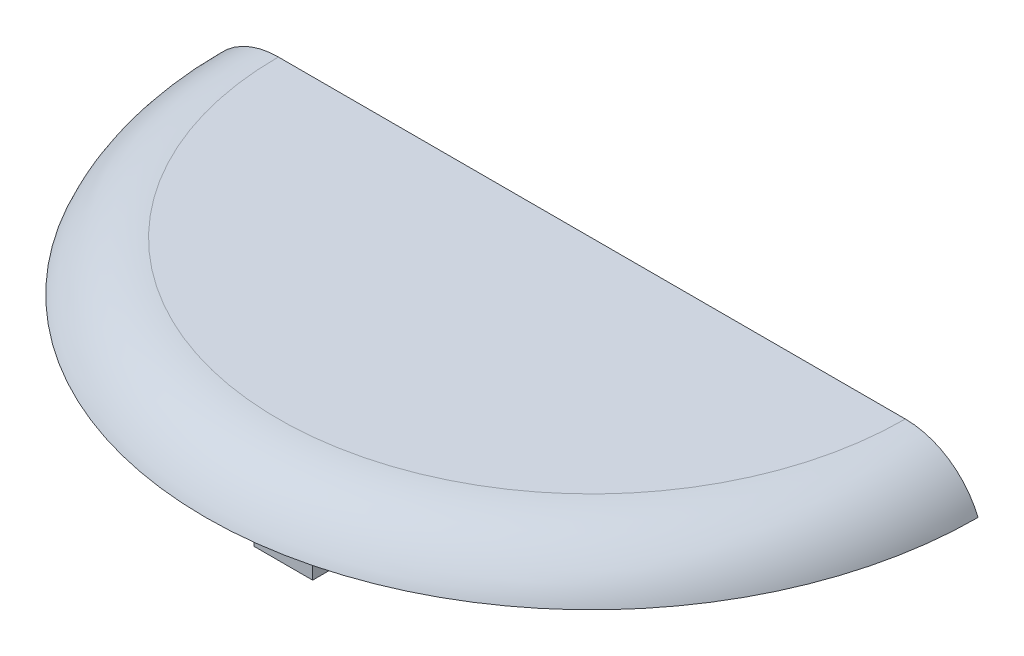
ISO-10303-21;
HEADER;
FILE_DESCRIPTION(('STEP AP214'),'2;1');
FILE_NAME('part.step','',(''),(''),'','','');
FILE_SCHEMA(('AUTOMOTIVE_DESIGN { 1 0 10303 214 1 1 1 1 }'));
ENDSEC;
DATA;
#1=APPLICATION_CONTEXT('core data for automotive mechanical design processes');
#2=APPLICATION_PROTOCOL_DEFINITION('international standard','automotive_design',2000,#1);
#3=PRODUCT_CONTEXT('',#1,'mechanical');
#4=PRODUCT('Part','Part','',(#3));
#5=PRODUCT_RELATED_PRODUCT_CATEGORY('part','',(#4));
#6=PRODUCT_DEFINITION_FORMATION('','',#4);
#7=PRODUCT_DEFINITION_CONTEXT('part definition',#1,'design');
#8=PRODUCT_DEFINITION('design','',#6,#7);
#9=PRODUCT_DEFINITION_SHAPE('','',#8);
#10=(LENGTH_UNIT() NAMED_UNIT(*) SI_UNIT(.MILLI.,.METRE.));
#11=(NAMED_UNIT(*) PLANE_ANGLE_UNIT() SI_UNIT($,.RADIAN.));
#12=(NAMED_UNIT(*) SI_UNIT($,.STERADIAN.) SOLID_ANGLE_UNIT());
#13=UNCERTAINTY_MEASURE_WITH_UNIT(LENGTH_MEASURE(1.E-05),#10,'distance_accuracy_value','');
#14=(GEOMETRIC_REPRESENTATION_CONTEXT(3) GLOBAL_UNCERTAINTY_ASSIGNED_CONTEXT((#13)) GLOBAL_UNIT_ASSIGNED_CONTEXT((#10,
#11,#12)) REPRESENTATION_CONTEXT('',''));
#15=CARTESIAN_POINT('',(0.,0.,0.));
#16=DIRECTION('',(0.,0.,1.));
#17=DIRECTION('',(1.,0.,0.));
#18=AXIS2_PLACEMENT_3D('',#15,#16,#17);
#19=CARTESIAN_POINT('',(0.,58.4278760968653,0.));
#20=DIRECTION('',(0.,1.,0.));
#21=DIRECTION('',(0.,0.,1.));
#22=AXIS2_PLACEMENT_3D('',#19,#20,#21);
#23=PLANE('',#22);
#24=DIRECTION('',(1.,0.,0.));
#25=VECTOR('',#24,1.);
#26=CARTESIAN_POINT('',(-3.,58.4278760968653,31.5));
#27=LINE('',#26,#25);
#28=CARTESIAN_POINT('',(-3.,58.4278760968653,31.5));
#29=VERTEX_POINT('',#28);
#30=CARTESIAN_POINT('',(3.,58.4278760968653,31.5));
#31=VERTEX_POINT('',#30);
#32=EDGE_CURVE('E123',#29,#31,#27,.T.);
#33=ORIENTED_EDGE('',*,*,#32,.T.);
#34=DIRECTION('',(0.,0.,-1.));
#35=VECTOR('',#34,1.);
#36=CARTESIAN_POINT('',(3.,58.4278760968653,28.5));
#37=LINE('',#36,#35);
#38=CARTESIAN_POINT('',(3.,58.4278760968653,28.5));
#39=VERTEX_POINT('',#38);
#40=EDGE_CURVE('E135',#31,#39,#37,.T.);
#41=ORIENTED_EDGE('',*,*,#40,.T.);
#42=DIRECTION('',(-1.,0.,0.));
#43=VECTOR('',#42,1.);
#44=CARTESIAN_POINT('',(-3.,58.4278760968653,28.5));
#45=LINE('',#44,#43);
#46=CARTESIAN_POINT('',(-3.,58.4278760968653,28.5));
#47=VERTEX_POINT('',#46);
#48=EDGE_CURVE('E100',#39,#47,#45,.T.);
#49=ORIENTED_EDGE('',*,*,#48,.T.);
#50=DIRECTION('',(0.,0.,1.));
#51=VECTOR('',#50,1.);
#52=CARTESIAN_POINT('',(-3.,58.4278760968653,28.5));
#53=LINE('',#52,#51);
#54=EDGE_CURVE('E57',#47,#29,#53,.T.);
#55=ORIENTED_EDGE('',*,*,#54,.T.);
#56=EDGE_LOOP('',(#33,#41,#49,#55));
#57=FACE_BOUND('',#56,.T.);
#58=CARTESIAN_POINT('',(0.,58.4278760968653,0.));
#59=DIRECTION('',(0.,1.,0.));
#60=DIRECTION('',(0.,0.,1.));
#61=AXIS2_PLACEMENT_3D('',#58,#59,#60);
#62=CIRCLE('',#61,39.4161984870957);
#63=CARTESIAN_POINT('',(39.4161984870957,58.4278760968653,0.));
#64=VERTEX_POINT('',#63);
#65=CARTESIAN_POINT('',(-39.4161984870957,58.4278760968653,2.77280175019557E-13));
#66=VERTEX_POINT('',#65);
#67=EDGE_CURVE('E12',#64,#66,#62,.F.);
#68=ORIENTED_EDGE('',*,*,#67,.T.);
#69=DIRECTION('',(-1.,0.,0.));
#70=VECTOR('',#69,1.);
#71=CARTESIAN_POINT('',(21.,58.4278760968653,0.));
#72=LINE('',#71,#70);
#73=EDGE_CURVE('E50',#64,#66,#72,.T.);
#74=ORIENTED_EDGE('',*,*,#73,.F.);
#75=EDGE_LOOP('',(#68,#74));
#76=FACE_BOUND('',#75,.T.);
#77=ADVANCED_FACE('F41',(#57,#76),#23,.F.);
#78=CARTESIAN_POINT('',(0.,60.9278760968653,15.));
#79=DIRECTION('',(0.,0.,-1.));
#80=DIRECTION('',(-1.,0.,0.));
#81=AXIS2_PLACEMENT_3D('',#78,#79,#80);
#82=PLANE('',#81);
#83=CARTESIAN_POINT('',(0.,60.9278760968653,15.));
#84=DIRECTION('',(0.,0.,-1.));
#85=DIRECTION('',(-1.,0.,0.));
#86=AXIS2_PLACEMENT_3D('',#83,#84,#85);
#87=CIRCLE('',#86,1.);
#88=CARTESIAN_POINT('',(-1.,60.9278760968653,15.));
#89=VERTEX_POINT('',#88);
#90=EDGE_CURVE('E167',#89,#89,#87,.T.);
#91=ORIENTED_EDGE('',*,*,#90,.T.);
#92=EDGE_LOOP('',(#91));
#93=FACE_BOUND('',#92,.T.);
#94=ADVANCED_FACE('F208',(#93),#82,.T.);
#95=CARTESIAN_POINT('',(-30.4161984870957,60.9278760968653,15.));
#96=DIRECTION('',(0.,0.,-1.));
#97=DIRECTION('',(-1.,0.,0.));
#98=AXIS2_PLACEMENT_3D('',#95,#96,#97);
#99=PLANE('',#98);
#100=CARTESIAN_POINT('',(-30.4161984870957,60.9278760968653,15.));
#101=DIRECTION('',(0.,0.,-1.));
#102=DIRECTION('',(-1.,0.,0.));
#103=AXIS2_PLACEMENT_3D('',#100,#101,#102);
#104=CIRCLE('',#103,0.999999999999998);
#105=CARTESIAN_POINT('',(-31.4161984870957,60.9278760968653,15.));
#106=VERTEX_POINT('',#105);
#107=EDGE_CURVE('E159',#106,#106,#104,.T.);
#108=ORIENTED_EDGE('',*,*,#107,.T.);
#109=EDGE_LOOP('',(#108));
#110=FACE_BOUND('',#109,.T.);
#111=ADVANCED_FACE('F204',(#110),#99,.T.);
#112=CARTESIAN_POINT('',(30.4161984870957,60.9278760968653,15.));
#113=DIRECTION('',(0.,0.,-1.));
#114=DIRECTION('',(-1.,0.,0.));
#115=AXIS2_PLACEMENT_3D('',#112,#113,#114);
#116=PLANE('',#115);
#117=CARTESIAN_POINT('',(30.4161984870957,60.9278760968653,15.));
#118=DIRECTION('',(0.,0.,-1.));
#119=DIRECTION('',(-1.,0.,0.));
#120=AXIS2_PLACEMENT_3D('',#117,#118,#119);
#121=CIRCLE('',#120,1.);
#122=CARTESIAN_POINT('',(29.4161984870957,60.9278760968653,15.));
#123=VERTEX_POINT('',#122);
#124=EDGE_CURVE('E150',#123,#123,#121,.T.);
#125=ORIENTED_EDGE('',*,*,#124,.T.);
#126=EDGE_LOOP('',(#125));
#127=FACE_BOUND('',#126,.T.);
#128=ADVANCED_FACE('F196',(#127),#116,.T.);
#129=CARTESIAN_POINT('',(0.,63.4278760968653,0.));
#130=DIRECTION('',(0.,1.,0.));
#131=DIRECTION('',(0.,0.,1.));
#132=AXIS2_PLACEMENT_3D('',#129,#130,#131);
#133=PLANE('',#132);
#134=DIRECTION('',(1.,0.,0.));
#135=VECTOR('',#134,1.);
#136=CARTESIAN_POINT('',(0.,63.4278760968653,0.));
#137=LINE('',#136,#135);
#138=CARTESIAN_POINT('',(-32.,63.4278760968653,2.51386656396706E-13));
#139=VERTEX_POINT('',#138);
#140=CARTESIAN_POINT('',(32.,63.4278760968653,0.));
#141=VERTEX_POINT('',#140);
#142=EDGE_CURVE('E183',#139,#141,#137,.T.);
#143=ORIENTED_EDGE('',*,*,#142,.F.);
#144=CARTESIAN_POINT('',(0.,63.4278760968653,0.));
#145=DIRECTION('',(0.,-1.,0.));
#146=DIRECTION('',(0.,0.,-1.));
#147=AXIS2_PLACEMENT_3D('',#144,#145,#146);
#148=CIRCLE('',#147,32.);
#149=EDGE_CURVE('E179',#141,#139,#148,.T.);
#150=ORIENTED_EDGE('',*,*,#149,.F.);
#151=EDGE_LOOP('',(#143,#150));
#152=FACE_BOUND('',#151,.T.);
#153=ADVANCED_FACE('F194',(#152),#133,.T.);
#154=CARTESIAN_POINT('',(0.,55.4278760968653,0.));
#155=DIRECTION('',(0.,-1.,0.));
#156=DIRECTION('',(0.,0.,-1.));
#157=AXIS2_PLACEMENT_3D('',#154,#155,#156);
#158=TOROIDAL_SURFACE('',#157,32.,8.);
#159=ORIENTED_EDGE('',*,*,#67,.F.);
#160=CARTESIAN_POINT('',(32.,55.4278760968653,-1.1172740284298E-13));
#161=DIRECTION('',(0.,0.,1.));
#162=DIRECTION('',(1.,0.,0.));
#163=AXIS2_PLACEMENT_3D('',#160,#161,#162);
#164=CIRCLE('',#163,8.);
#165=EDGE_CURVE('E154',#141,#64,#164,.F.);
#166=ORIENTED_EDGE('',*,*,#165,.F.);
#167=ORIENTED_EDGE('',*,*,#149,.T.);
#168=CARTESIAN_POINT('',(-32.,55.4278760968653,1.1172740284298E-13));
#169=DIRECTION('',(0.,0.,1.));
#170=DIRECTION('',(1.,0.,0.));
#171=AXIS2_PLACEMENT_3D('',#168,#169,#170);
#172=CIRCLE('',#171,8.);
#173=EDGE_CURVE('E176',#66,#139,#172,.F.);
#174=ORIENTED_EDGE('',*,*,#173,.F.);
#175=EDGE_LOOP('',(#159,#166,#167,#174));
#176=FACE_BOUND('',#175,.T.);
#177=ADVANCED_FACE('F193',(#176),#158,.T.);
#178=CARTESIAN_POINT('',(0.,60.9278760968653,15.));
#179=DIRECTION('',(0.,0.,-1.));
#180=DIRECTION('',(-1.,0.,0.));
#181=AXIS2_PLACEMENT_3D('',#178,#179,#180);
#182=CYLINDRICAL_SURFACE('',#181,1.);
#183=ORIENTED_EDGE('',*,*,#90,.F.);
#184=EDGE_LOOP('',(#183));
#185=FACE_BOUND('',#184,.T.);
#186=CARTESIAN_POINT('',(0.,60.9278760968653,0.));
#187=DIRECTION('',(0.,0.,-1.));
#188=DIRECTION('',(-1.,0.,0.));
#189=AXIS2_PLACEMENT_3D('',#186,#187,#188);
#190=CIRCLE('',#189,1.);
#191=CARTESIAN_POINT('',(-1.,60.9278760968653,0.));
#192=VERTEX_POINT('',#191);
#193=EDGE_CURVE('E144',#192,#192,#190,.T.);
#194=ORIENTED_EDGE('',*,*,#193,.T.);
#195=EDGE_LOOP('',(#194));
#196=FACE_BOUND('',#195,.T.);
#197=ADVANCED_FACE('F201',(#185,#196),#182,.F.);
#198=CARTESIAN_POINT('',(-30.4161984870957,60.9278760968653,15.));
#199=DIRECTION('',(0.,0.,-1.));
#200=DIRECTION('',(-1.,0.,0.));
#201=AXIS2_PLACEMENT_3D('',#198,#199,#200);
#202=CYLINDRICAL_SURFACE('',#201,0.999999999999998);
#203=ORIENTED_EDGE('',*,*,#107,.F.);
#204=EDGE_LOOP('',(#203));
#205=FACE_BOUND('',#204,.T.);
#206=CARTESIAN_POINT('',(-30.4161984870957,60.9278760968653,0.));
#207=DIRECTION('',(0.,0.,-1.));
#208=DIRECTION('',(-1.,0.,0.));
#209=AXIS2_PLACEMENT_3D('',#206,#207,#208);
#210=CIRCLE('',#209,0.999999999999998);
#211=CARTESIAN_POINT('',(-31.4161984870957,60.9278760968653,0.));
#212=VERTEX_POINT('',#211);
#213=EDGE_CURVE('E163',#212,#212,#210,.T.);
#214=ORIENTED_EDGE('',*,*,#213,.T.);
#215=EDGE_LOOP('',(#214));
#216=FACE_BOUND('',#215,.T.);
#217=ADVANCED_FACE('F229',(#205,#216),#202,.F.);
#218=CARTESIAN_POINT('',(30.4161984870957,60.9278760968653,15.));
#219=DIRECTION('',(0.,0.,-1.));
#220=DIRECTION('',(-1.,0.,0.));
#221=AXIS2_PLACEMENT_3D('',#218,#219,#220);
#222=CYLINDRICAL_SURFACE('',#221,1.);
#223=ORIENTED_EDGE('',*,*,#124,.F.);
#224=EDGE_LOOP('',(#223));
#225=FACE_BOUND('',#224,.T.);
#226=CARTESIAN_POINT('',(30.4161984870957,60.9278760968653,0.));
#227=DIRECTION('',(0.,0.,-1.));
#228=DIRECTION('',(-1.,0.,0.));
#229=AXIS2_PLACEMENT_3D('',#226,#227,#228);
#230=CIRCLE('',#229,1.);
#231=CARTESIAN_POINT('',(29.4161984870957,60.9278760968653,0.));
#232=VERTEX_POINT('',#231);
#233=EDGE_CURVE('E155',#232,#232,#230,.T.);
#234=ORIENTED_EDGE('',*,*,#233,.T.);
#235=EDGE_LOOP('',(#234));
#236=FACE_BOUND('',#235,.T.);
#237=ADVANCED_FACE('F219',(#225,#236),#222,.F.);
#238=CARTESIAN_POINT('',(21.,73.,0.));
#239=DIRECTION('',(0.,0.,1.));
#240=DIRECTION('',(1.,0.,0.));
#241=AXIS2_PLACEMENT_3D('',#238,#239,#240);
#242=PLANE('',#241);
#243=ORIENTED_EDGE('',*,*,#233,.F.);
#244=EDGE_LOOP('',(#243));
#245=FACE_BOUND('',#244,.T.);
#246=ORIENTED_EDGE('',*,*,#213,.F.);
#247=EDGE_LOOP('',(#246));
#248=FACE_BOUND('',#247,.T.);
#249=ORIENTED_EDGE('',*,*,#193,.F.);
#250=EDGE_LOOP('',(#249));
#251=FACE_BOUND('',#250,.T.);
#252=ORIENTED_EDGE('',*,*,#165,.T.);
#253=ORIENTED_EDGE('',*,*,#73,.T.);
#254=ORIENTED_EDGE('',*,*,#173,.T.);
#255=ORIENTED_EDGE('',*,*,#142,.T.);
#256=EDGE_LOOP('',(#252,#253,#254,#255));
#257=FACE_BOUND('',#256,.T.);
#258=ADVANCED_FACE('F188',(#245,#248,#251,#257),#242,.F.);
#259=CARTESIAN_POINT('',(3.,50.4278760968653,28.5));
#260=DIRECTION('',(1.,0.,0.));
#261=DIRECTION('',(0.,0.,-1.));
#262=AXIS2_PLACEMENT_3D('',#259,#260,#261);
#263=PLANE('',#262);
#264=CARTESIAN_POINT('',(3.,54.4278760968653,30.));
#265=DIRECTION('',(1.,0.,0.));
#266=DIRECTION('',(0.,0.,-1.));
#267=AXIS2_PLACEMENT_3D('',#264,#265,#266);
#268=CIRCLE('',#267,1.);
#269=CARTESIAN_POINT('',(3.,54.4278760968653,29.));
#270=VERTEX_POINT('',#269);
#271=EDGE_CURVE('E129',#270,#270,#268,.T.);
#272=ORIENTED_EDGE('',*,*,#271,.F.);
#273=EDGE_LOOP('',(#272));
#274=FACE_BOUND('',#273,.T.);
#275=ORIENTED_EDGE('',*,*,#40,.F.);
#276=DIRECTION('',(0.,1.,0.));
#277=VECTOR('',#276,1.);
#278=CARTESIAN_POINT('',(3.,50.4278760968653,31.5));
#279=LINE('',#278,#277);
#280=CARTESIAN_POINT('',(3.,50.4278760968653,31.5));
#281=VERTEX_POINT('',#280);
#282=EDGE_CURVE('E121',#281,#31,#279,.T.);
#283=ORIENTED_EDGE('',*,*,#282,.F.);
#284=DIRECTION('',(0.,0.,-1.));
#285=VECTOR('',#284,1.);
#286=CARTESIAN_POINT('',(3.,50.4278760968653,28.5));
#287=LINE('',#286,#285);
#288=CARTESIAN_POINT('',(3.,50.4278760968653,28.5));
#289=VERTEX_POINT('',#288);
#290=EDGE_CURVE('E114',#281,#289,#287,.T.);
#291=ORIENTED_EDGE('',*,*,#290,.T.);
#292=DIRECTION('',(0.,1.,0.));
#293=VECTOR('',#292,1.);
#294=CARTESIAN_POINT('',(3.,50.4278760968653,28.5));
#295=LINE('',#294,#293);
#296=EDGE_CURVE('E95',#289,#39,#295,.T.);
#297=ORIENTED_EDGE('',*,*,#296,.T.);
#298=EDGE_LOOP('',(#275,#283,#291,#297));
#299=FACE_BOUND('',#298,.T.);
#300=ADVANCED_FACE('F120',(#274,#299),#263,.T.);
#301=CARTESIAN_POINT('',(-3.,50.4278760968653,31.5));
#302=DIRECTION('',(0.,0.,1.));
#303=DIRECTION('',(1.,0.,0.));
#304=AXIS2_PLACEMENT_3D('',#301,#302,#303);
#305=PLANE('',#304);
#306=ORIENTED_EDGE('',*,*,#32,.F.);
#307=DIRECTION('',(0.,1.,0.));
#308=VECTOR('',#307,1.);
#309=CARTESIAN_POINT('',(-3.,50.4278760968653,31.5));
#310=LINE('',#309,#308);
#311=CARTESIAN_POINT('',(-3.,50.4278760968653,31.5));
#312=VERTEX_POINT('',#311);
#313=EDGE_CURVE('E145',#312,#29,#310,.T.);
#314=ORIENTED_EDGE('',*,*,#313,.F.);
#315=DIRECTION('',(1.,0.,0.));
#316=VECTOR('',#315,1.);
#317=CARTESIAN_POINT('',(-3.,50.4278760968653,31.5));
#318=LINE('',#317,#316);
#319=EDGE_CURVE('E107',#312,#281,#318,.T.);
#320=ORIENTED_EDGE('',*,*,#319,.T.);
#321=ORIENTED_EDGE('',*,*,#282,.T.);
#322=EDGE_LOOP('',(#306,#314,#320,#321));
#323=FACE_BOUND('',#322,.T.);
#324=ADVANCED_FACE('F225',(#323),#305,.T.);
#325=CARTESIAN_POINT('',(-3.,50.4278760968653,28.5));
#326=DIRECTION('',(-1.,0.,0.));
#327=DIRECTION('',(0.,0.,1.));
#328=AXIS2_PLACEMENT_3D('',#325,#326,#327);
#329=PLANE('',#328);
#330=CARTESIAN_POINT('',(-3.,54.4278760968653,30.));
#331=DIRECTION('',(-1.,0.,0.));
#332=DIRECTION('',(0.,0.,1.));
#333=AXIS2_PLACEMENT_3D('',#330,#331,#332);
#334=CIRCLE('',#333,1.);
#335=CARTESIAN_POINT('',(-3.,54.4278760968653,31.));
#336=VERTEX_POINT('',#335);
#337=EDGE_CURVE('E44',#336,#336,#334,.T.);
#338=ORIENTED_EDGE('',*,*,#337,.F.);
#339=EDGE_LOOP('',(#338));
#340=FACE_BOUND('',#339,.T.);
#341=ORIENTED_EDGE('',*,*,#54,.F.);
#342=DIRECTION('',(0.,1.,0.));
#343=VECTOR('',#342,1.);
#344=CARTESIAN_POINT('',(-3.,50.4278760968653,28.5));
#345=LINE('',#344,#343);
#346=CARTESIAN_POINT('',(-3.,50.4278760968653,28.5));
#347=VERTEX_POINT('',#346);
#348=EDGE_CURVE('E106',#347,#47,#345,.T.);
#349=ORIENTED_EDGE('',*,*,#348,.F.);
#350=DIRECTION('',(0.,0.,1.));
#351=VECTOR('',#350,1.);
#352=CARTESIAN_POINT('',(-3.,50.4278760968653,28.5));
#353=LINE('',#352,#351);
#354=EDGE_CURVE('E117',#347,#312,#353,.T.);
#355=ORIENTED_EDGE('',*,*,#354,.T.);
#356=ORIENTED_EDGE('',*,*,#313,.T.);
#357=EDGE_LOOP('',(#341,#349,#355,#356));
#358=FACE_BOUND('',#357,.T.);
#359=ADVANCED_FACE('F246',(#340,#358),#329,.T.);
#360=CARTESIAN_POINT('',(-3.,50.4278760968653,28.5));
#361=DIRECTION('',(0.,0.,-1.));
#362=DIRECTION('',(-1.,0.,0.));
#363=AXIS2_PLACEMENT_3D('',#360,#361,#362);
#364=PLANE('',#363);
#365=ORIENTED_EDGE('',*,*,#48,.F.);
#366=ORIENTED_EDGE('',*,*,#296,.F.);
#367=DIRECTION('',(-1.,0.,0.));
#368=VECTOR('',#367,1.);
#369=CARTESIAN_POINT('',(-3.,50.4278760968653,28.5));
#370=LINE('',#369,#368);
#371=EDGE_CURVE('E98',#289,#347,#370,.T.);
#372=ORIENTED_EDGE('',*,*,#371,.T.);
#373=ORIENTED_EDGE('',*,*,#348,.T.);
#374=EDGE_LOOP('',(#365,#366,#372,#373));
#375=FACE_BOUND('',#374,.T.);
#376=ADVANCED_FACE('F97',(#375),#364,.T.);
#377=CARTESIAN_POINT('',(0.,50.4278760968653,0.));
#378=DIRECTION('',(0.,1.,0.));
#379=DIRECTION('',(0.,0.,1.));
#380=AXIS2_PLACEMENT_3D('',#377,#378,#379);
#381=PLANE('',#380);
#382=ORIENTED_EDGE('',*,*,#290,.F.);
#383=ORIENTED_EDGE('',*,*,#319,.F.);
#384=ORIENTED_EDGE('',*,*,#354,.F.);
#385=ORIENTED_EDGE('',*,*,#371,.F.);
#386=EDGE_LOOP('',(#382,#383,#384,#385));
#387=FACE_BOUND('',#386,.T.);
#388=ADVANCED_FACE('F112',(#387),#381,.F.);
#389=CARTESIAN_POINT('',(-4.5,54.4278760968653,30.));
#390=DIRECTION('',(1.,0.,0.));
#391=DIRECTION('',(0.,0.,-1.));
#392=AXIS2_PLACEMENT_3D('',#389,#390,#391);
#393=CYLINDRICAL_SURFACE('',#392,1.);
#394=ORIENTED_EDGE('',*,*,#337,.T.);
#395=EDGE_LOOP('',(#394));
#396=FACE_BOUND('',#395,.T.);
#397=ORIENTED_EDGE('',*,*,#271,.T.);
#398=EDGE_LOOP('',(#397));
#399=FACE_BOUND('',#398,.T.);
#400=ADVANCED_FACE('F255',(#396,#399),#393,.F.);
#401=CLOSED_SHELL('',(#77,#94,#111,#128,#153,#177,#197,#217,#237,#258,#300,#324,#359,#376,#388,#400));
#402=MANIFOLD_SOLID_BREP('B2',#401);
#403=ADVANCED_BREP_SHAPE_REPRESENTATION('',(#18,#402),#14);
#404=SHAPE_DEFINITION_REPRESENTATION(#9,#403);
ENDSEC;
END-ISO-10303-21;
